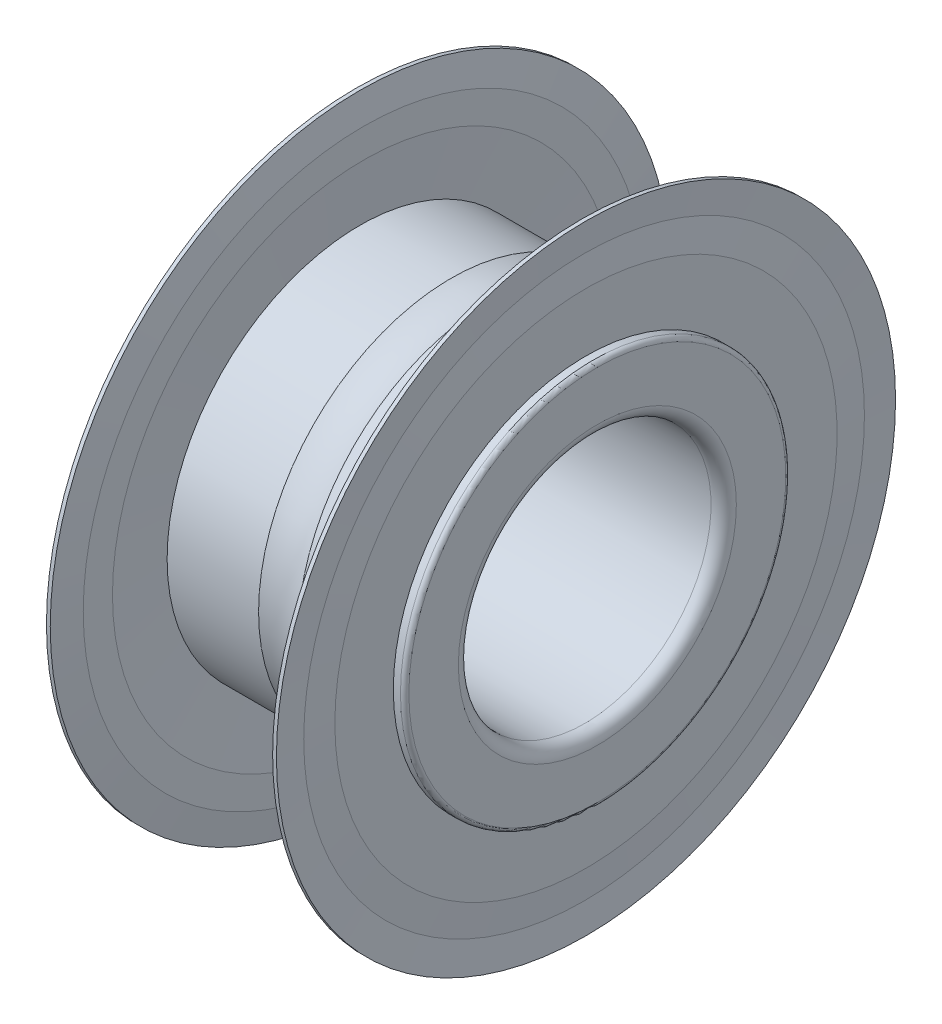
ISO-10303-21;
HEADER;
FILE_DESCRIPTION(('STEP AP214'),'2;1');
FILE_NAME('part.step','',(''),(''),'','','');
FILE_SCHEMA(('AUTOMOTIVE_DESIGN { 1 0 10303 214 1 1 1 1 }'));
ENDSEC;
DATA;
#1=APPLICATION_CONTEXT('core data for automotive mechanical design processes');
#2=APPLICATION_PROTOCOL_DEFINITION('international standard','automotive_design',2000,#1);
#3=PRODUCT_CONTEXT('',#1,'mechanical');
#4=PRODUCT('Part','Part','',(#3));
#5=PRODUCT_RELATED_PRODUCT_CATEGORY('part','',(#4));
#6=PRODUCT_DEFINITION_FORMATION('','',#4);
#7=PRODUCT_DEFINITION_CONTEXT('part definition',#1,'design');
#8=PRODUCT_DEFINITION('design','',#6,#7);
#9=PRODUCT_DEFINITION_SHAPE('','',#8);
#10=(LENGTH_UNIT() NAMED_UNIT(*) SI_UNIT(.MILLI.,.METRE.));
#11=(NAMED_UNIT(*) PLANE_ANGLE_UNIT() SI_UNIT($,.RADIAN.));
#12=(NAMED_UNIT(*) SI_UNIT($,.STERADIAN.) SOLID_ANGLE_UNIT());
#13=UNCERTAINTY_MEASURE_WITH_UNIT(LENGTH_MEASURE(1.E-05),#10,'distance_accuracy_value','');
#14=(GEOMETRIC_REPRESENTATION_CONTEXT(3) GLOBAL_UNCERTAINTY_ASSIGNED_CONTEXT((#13)) GLOBAL_UNIT_ASSIGNED_CONTEXT((#10,
#11,#12)) REPRESENTATION_CONTEXT('',''));
#15=CARTESIAN_POINT('',(0.,0.,0.));
#16=DIRECTION('',(0.,0.,1.));
#17=DIRECTION('',(1.,0.,0.));
#18=AXIS2_PLACEMENT_3D('',#15,#16,#17);
#19=CARTESIAN_POINT('',(50.,0.,0.));
#20=DIRECTION('',(-1.,0.,0.));
#21=DIRECTION('',(0.,0.,1.));
#22=AXIS2_PLACEMENT_3D('',#19,#20,#21);
#23=CYLINDRICAL_SURFACE('',#22,3.05);
#24=CARTESIAN_POINT('',(2.3122498999199,0.,0.));
#25=DIRECTION('',(-1.,0.,0.));
#26=DIRECTION('',(0.,0.,1.));
#27=AXIS2_PLACEMENT_3D('',#24,#25,#26);
#28=CIRCLE('',#27,3.05);
#29=CARTESIAN_POINT('',(2.3122498999199,0.,3.05));
#30=VERTEX_POINT('',#29);
#31=EDGE_CURVE('E72',#30,#30,#28,.T.);
#32=ORIENTED_EDGE('',*,*,#31,.F.);
#33=EDGE_LOOP('',(#32));
#34=FACE_BOUND('',#33,.T.);
#35=CARTESIAN_POINT('',(3.76,0.,0.));
#36=DIRECTION('',(-1.,0.,0.));
#37=DIRECTION('',(0.,0.,1.));
#38=AXIS2_PLACEMENT_3D('',#35,#36,#37);
#39=CIRCLE('',#38,3.05);
#40=CARTESIAN_POINT('',(3.76,0.,3.05));
#41=VERTEX_POINT('',#40);
#42=EDGE_CURVE('E10',#41,#41,#39,.F.);
#43=ORIENTED_EDGE('',*,*,#42,.F.);
#44=EDGE_LOOP('',(#43));
#45=FACE_BOUND('',#44,.T.);
#46=ADVANCED_FACE('F31',(#34,#45),#23,.T.);
#47=CARTESIAN_POINT('',(3.9333333333333,0.,0.));
#48=DIRECTION('',(-1.,0.,0.));
#49=DIRECTION('',(0.,0.,1.));
#50=AXIS2_PLACEMENT_3D('',#47,#48,#49);
#51=CIRCLE('',#50,3.05);
#52=CARTESIAN_POINT('',(3.9333333333333,0.,3.05));
#53=VERTEX_POINT('',#52);
#54=EDGE_CURVE('E69',#53,#53,#51,.T.);
#55=ORIENTED_EDGE('',*,*,#54,.T.);
#56=EDGE_LOOP('',(#55));
#57=FACE_BOUND('',#56,.T.);
#58=CARTESIAN_POINT('',(3.82,0.,0.));
#59=DIRECTION('',(-1.,0.,0.));
#60=DIRECTION('',(0.,0.,1.));
#61=AXIS2_PLACEMENT_3D('',#58,#59,#60);
#62=CIRCLE('',#61,3.05);
#63=CARTESIAN_POINT('',(3.82,0.,3.05));
#64=VERTEX_POINT('',#63);
#65=EDGE_CURVE('E38',#64,#64,#62,.T.);
#66=ORIENTED_EDGE('',*,*,#65,.F.);
#67=EDGE_LOOP('',(#66));
#68=FACE_BOUND('',#67,.T.);
#69=ADVANCED_FACE('F148',(#57,#68),#23,.T.);
#70=CARTESIAN_POINT('',(50.,0.,0.));
#71=DIRECTION('',(-1.,0.,0.));
#72=DIRECTION('',(0.,0.,1.));
#73=AXIS2_PLACEMENT_3D('',#70,#71,#72);
#74=CYLINDRICAL_SURFACE('',#73,3.05);
#75=CARTESIAN_POINT('',(0.0666666666666663,0.,0.));
#76=DIRECTION('',(-1.,0.,0.));
#77=DIRECTION('',(0.,0.,1.));
#78=AXIS2_PLACEMENT_3D('',#75,#76,#77);
#79=CIRCLE('',#78,3.05);
#80=CARTESIAN_POINT('',(0.0666666666666663,0.,3.05));
#81=VERTEX_POINT('',#80);
#82=EDGE_CURVE('E78',#81,#81,#79,.T.);
#83=ORIENTED_EDGE('',*,*,#82,.F.);
#84=EDGE_LOOP('',(#83));
#85=FACE_BOUND('',#84,.T.);
#86=CARTESIAN_POINT('',(0.18,0.,0.));
#87=DIRECTION('',(1.,0.,0.));
#88=DIRECTION('',(0.,0.,-1.));
#89=AXIS2_PLACEMENT_3D('',#86,#87,#88);
#90=CIRCLE('',#89,3.05);
#91=CARTESIAN_POINT('',(0.18,0.,-3.05));
#92=VERTEX_POINT('',#91);
#93=EDGE_CURVE('E42',#92,#92,#90,.T.);
#94=ORIENTED_EDGE('',*,*,#93,.F.);
#95=EDGE_LOOP('',(#94));
#96=FACE_BOUND('',#95,.T.);
#97=ADVANCED_FACE('F154',(#85,#96),#74,.T.);
#98=CARTESIAN_POINT('',(1.6877501000801,0.,0.));
#99=DIRECTION('',(-1.,0.,0.));
#100=DIRECTION('',(0.,0.,1.));
#101=AXIS2_PLACEMENT_3D('',#98,#99,#100);
#102=CIRCLE('',#101,3.05);
#103=CARTESIAN_POINT('',(1.6877501000801,0.,3.05));
#104=VERTEX_POINT('',#103);
#105=EDGE_CURVE('E75',#104,#104,#102,.T.);
#106=ORIENTED_EDGE('',*,*,#105,.T.);
#107=EDGE_LOOP('',(#106));
#108=FACE_BOUND('',#107,.T.);
#109=CARTESIAN_POINT('',(0.239999999999997,0.,0.));
#110=DIRECTION('',(1.,0.,0.));
#111=DIRECTION('',(0.,0.,-1.));
#112=AXIS2_PLACEMENT_3D('',#109,#110,#111);
#113=CIRCLE('',#112,3.05);
#114=CARTESIAN_POINT('',(0.239999999999997,0.,-3.05));
#115=VERTEX_POINT('',#114);
#116=EDGE_CURVE('E46',#115,#115,#113,.F.);
#117=ORIENTED_EDGE('',*,*,#116,.F.);
#118=EDGE_LOOP('',(#117));
#119=FACE_BOUND('',#118,.T.);
#120=ADVANCED_FACE('F187',(#108,#119),#74,.T.);
#121=CARTESIAN_POINT('',(0.0666666666667299,0.,0.));
#122=DIRECTION('',(-1.,0.,0.));
#123=DIRECTION('',(0.,0.,1.));
#124=AXIS2_PLACEMENT_3D('',#121,#122,#123);
#125=TOROIDAL_SURFACE('',#124,2.98333333333327,0.06666666666673);
#126=CARTESIAN_POINT('',(0.,0.,0.));
#127=DIRECTION('',(-1.,0.,0.));
#128=DIRECTION('',(0.,0.,1.));
#129=AXIS2_PLACEMENT_3D('',#126,#127,#128);
#130=CIRCLE('',#129,2.9833333333333);
#131=CARTESIAN_POINT('',(0.,0.,2.9833333333333));
#132=VERTEX_POINT('',#131);
#133=EDGE_CURVE('E51',#132,#132,#130,.T.);
#134=ORIENTED_EDGE('',*,*,#133,.F.);
#135=EDGE_LOOP('',(#134));
#136=FACE_BOUND('',#135,.T.);
#137=ORIENTED_EDGE('',*,*,#82,.T.);
#138=EDGE_LOOP('',(#137));
#139=FACE_BOUND('',#138,.T.);
#140=ADVANCED_FACE('F33',(#136,#139),#125,.T.);
#141=CARTESIAN_POINT('',(0.,2.9833333333333,0.));
#142=DIRECTION('',(1.,0.,0.));
#143=DIRECTION('',(0.,0.,-1.));
#144=AXIS2_PLACEMENT_3D('',#141,#142,#143);
#145=PLANE('',#144);
#146=CARTESIAN_POINT('',(0.,0.,0.));
#147=DIRECTION('',(-1.,0.,0.));
#148=DIRECTION('',(0.,0.,1.));
#149=AXIS2_PLACEMENT_3D('',#146,#147,#148);
#150=CIRCLE('',#149,2.2);
#151=CARTESIAN_POINT('',(0.,0.,2.2));
#152=VERTEX_POINT('',#151);
#153=EDGE_CURVE('E54',#152,#152,#150,.T.);
#154=ORIENTED_EDGE('',*,*,#153,.F.);
#155=EDGE_LOOP('',(#154));
#156=FACE_BOUND('',#155,.T.);
#157=ORIENTED_EDGE('',*,*,#133,.T.);
#158=EDGE_LOOP('',(#157));
#159=FACE_BOUND('',#158,.T.);
#160=ADVANCED_FACE('F180',(#156,#159),#145,.F.);
#161=CARTESIAN_POINT('',(0.200000000000017,0.,0.));
#162=DIRECTION('',(-1.,0.,0.));
#163=DIRECTION('',(0.,0.,1.));
#164=AXIS2_PLACEMENT_3D('',#161,#162,#163);
#165=TOROIDAL_SURFACE('',#164,2.20000000000002,0.200000000000017);
#166=CARTESIAN_POINT('',(0.199999999999999,0.,0.));
#167=DIRECTION('',(-1.,0.,0.));
#168=DIRECTION('',(0.,0.,1.));
#169=AXIS2_PLACEMENT_3D('',#166,#167,#168);
#170=CIRCLE('',#169,2.);
#171=CARTESIAN_POINT('',(0.199999999999999,0.,2.));
#172=VERTEX_POINT('',#171);
#173=EDGE_CURVE('E57',#172,#172,#170,.T.);
#174=ORIENTED_EDGE('',*,*,#173,.F.);
#175=EDGE_LOOP('',(#174));
#176=FACE_BOUND('',#175,.T.);
#177=ORIENTED_EDGE('',*,*,#153,.T.);
#178=EDGE_LOOP('',(#177));
#179=FACE_BOUND('',#178,.T.);
#180=ADVANCED_FACE('F177',(#176,#179),#165,.T.);
#181=CARTESIAN_POINT('',(50.,0.,0.));
#182=DIRECTION('',(-1.,0.,0.));
#183=DIRECTION('',(0.,0.,1.));
#184=AXIS2_PLACEMENT_3D('',#181,#182,#183);
#185=CYLINDRICAL_SURFACE('',#184,2.);
#186=CARTESIAN_POINT('',(3.8,0.,0.));
#187=DIRECTION('',(-1.,0.,0.));
#188=DIRECTION('',(0.,0.,1.));
#189=AXIS2_PLACEMENT_3D('',#186,#187,#188);
#190=CIRCLE('',#189,2.);
#191=CARTESIAN_POINT('',(3.8,0.,2.));
#192=VERTEX_POINT('',#191);
#193=EDGE_CURVE('E60',#192,#192,#190,.T.);
#194=ORIENTED_EDGE('',*,*,#193,.F.);
#195=EDGE_LOOP('',(#194));
#196=FACE_BOUND('',#195,.T.);
#197=ORIENTED_EDGE('',*,*,#173,.T.);
#198=EDGE_LOOP('',(#197));
#199=FACE_BOUND('',#198,.T.);
#200=ADVANCED_FACE('F173',(#196,#199),#185,.F.);
#201=CARTESIAN_POINT('',(3.79999999999997,0.,0.));
#202=DIRECTION('',(-1.,0.,0.));
#203=DIRECTION('',(0.,0.,1.));
#204=AXIS2_PLACEMENT_3D('',#201,#202,#203);
#205=TOROIDAL_SURFACE('',#204,2.20000000000003,0.200000000000033);
#206=CARTESIAN_POINT('',(4.,0.,0.));
#207=DIRECTION('',(-1.,0.,0.));
#208=DIRECTION('',(0.,0.,1.));
#209=AXIS2_PLACEMENT_3D('',#206,#207,#208);
#210=CIRCLE('',#209,2.20000000000003);
#211=CARTESIAN_POINT('',(4.,0.,2.20000000000003));
#212=VERTEX_POINT('',#211);
#213=EDGE_CURVE('E63',#212,#212,#210,.T.);
#214=ORIENTED_EDGE('',*,*,#213,.F.);
#215=EDGE_LOOP('',(#214));
#216=FACE_BOUND('',#215,.T.);
#217=ORIENTED_EDGE('',*,*,#193,.T.);
#218=EDGE_LOOP('',(#217));
#219=FACE_BOUND('',#218,.T.);
#220=ADVANCED_FACE('F169',(#216,#219),#205,.T.);
#221=CARTESIAN_POINT('',(4.,2.2,0.));
#222=DIRECTION('',(-1.,0.,0.));
#223=DIRECTION('',(0.,0.,1.));
#224=AXIS2_PLACEMENT_3D('',#221,#222,#223);
#225=PLANE('',#224);
#226=CARTESIAN_POINT('',(4.,0.,0.));
#227=DIRECTION('',(-1.,0.,0.));
#228=DIRECTION('',(0.,0.,1.));
#229=AXIS2_PLACEMENT_3D('',#226,#227,#228);
#230=CIRCLE('',#229,2.9833333333333);
#231=CARTESIAN_POINT('',(4.,0.,2.9833333333333));
#232=VERTEX_POINT('',#231);
#233=EDGE_CURVE('E66',#232,#232,#230,.T.);
#234=ORIENTED_EDGE('',*,*,#233,.F.);
#235=EDGE_LOOP('',(#234));
#236=FACE_BOUND('',#235,.T.);
#237=ORIENTED_EDGE('',*,*,#213,.T.);
#238=EDGE_LOOP('',(#237));
#239=FACE_BOUND('',#238,.T.);
#240=ADVANCED_FACE('F165',(#236,#239),#225,.F.);
#241=CARTESIAN_POINT('',(3.93333333333321,0.,0.));
#242=DIRECTION('',(-1.,0.,0.));
#243=DIRECTION('',(0.,0.,1.));
#244=AXIS2_PLACEMENT_3D('',#241,#242,#243);
#245=TOROIDAL_SURFACE('',#244,2.98333333333321,0.0666666666667918);
#246=ORIENTED_EDGE('',*,*,#54,.F.);
#247=EDGE_LOOP('',(#246));
#248=FACE_BOUND('',#247,.T.);
#249=ORIENTED_EDGE('',*,*,#233,.T.);
#250=EDGE_LOOP('',(#249));
#251=FACE_BOUND('',#250,.T.);
#252=ADVANCED_FACE('F162',(#248,#251),#245,.T.);
#253=CARTESIAN_POINT('',(2.,0.,0.));
#254=DIRECTION('',(-1.,0.,0.));
#255=DIRECTION('',(0.,0.,1.));
#256=AXIS2_PLACEMENT_3D('',#253,#254,#255);
#257=TOROIDAL_SURFACE('',#256,3.99999999999988,0.999999999999878);
#258=ORIENTED_EDGE('',*,*,#105,.F.);
#259=EDGE_LOOP('',(#258));
#260=FACE_BOUND('',#259,.T.);
#261=ORIENTED_EDGE('',*,*,#31,.T.);
#262=EDGE_LOOP('',(#261));
#263=FACE_BOUND('',#262,.T.);
#264=ADVANCED_FACE('F160',(#260,#263),#257,.F.);
#265=CARTESIAN_POINT('',(50.,0.,0.));
#266=DIRECTION('',(-1.,0.,0.));
#267=DIRECTION('',(0.,0.,1.));
#268=AXIS2_PLACEMENT_3D('',#265,#266,#267);
#269=CYLINDRICAL_SURFACE('',#268,4.9);
#270=CARTESIAN_POINT('',(0.18,0.,0.));
#271=DIRECTION('',(-1.,0.,0.));
#272=DIRECTION('',(0.,0.,1.));
#273=AXIS2_PLACEMENT_3D('',#270,#271,#272);
#274=CIRCLE('',#273,4.9);
#275=CARTESIAN_POINT('',(0.18,0.,4.9));
#276=VERTEX_POINT('',#275);
#277=EDGE_CURVE('E81',#276,#276,#274,.T.);
#278=ORIENTED_EDGE('',*,*,#277,.F.);
#279=EDGE_LOOP('',(#278));
#280=FACE_BOUND('',#279,.T.);
#281=CARTESIAN_POINT('',(0.239999999999997,0.,0.));
#282=DIRECTION('',(-1.,0.,0.));
#283=DIRECTION('',(0.,0.,1.));
#284=AXIS2_PLACEMENT_3D('',#281,#282,#283);
#285=CIRCLE('',#284,4.9);
#286=CARTESIAN_POINT('',(0.239999999999997,0.,4.9));
#287=VERTEX_POINT('',#286);
#288=EDGE_CURVE('E96',#287,#287,#285,.T.);
#289=ORIENTED_EDGE('',*,*,#288,.T.);
#290=EDGE_LOOP('',(#289));
#291=FACE_BOUND('',#290,.T.);
#292=ADVANCED_FACE('F215',(#280,#291),#269,.T.);
#293=CARTESIAN_POINT('',(0.18,0.,0.));
#294=DIRECTION('',(-1.,0.,0.));
#295=DIRECTION('',(0.,0.,1.));
#296=AXIS2_PLACEMENT_3D('',#293,#294,#295);
#297=CONICAL_SURFACE('',#296,4.9,1.50602220486897);
#298=CARTESIAN_POINT('',(0.210000000000002,0.,0.));
#299=DIRECTION('',(-1.,0.,0.));
#300=DIRECTION('',(0.,0.,1.));
#301=AXIS2_PLACEMENT_3D('',#298,#299,#300);
#302=CIRCLE('',#301,4.4375);
#303=CARTESIAN_POINT('',(0.210000000000002,0.,4.4375));
#304=VERTEX_POINT('',#303);
#305=EDGE_CURVE('E84',#304,#304,#302,.T.);
#306=ORIENTED_EDGE('',*,*,#305,.F.);
#307=EDGE_LOOP('',(#306));
#308=FACE_BOUND('',#307,.T.);
#309=ORIENTED_EDGE('',*,*,#277,.T.);
#310=EDGE_LOOP('',(#309));
#311=FACE_BOUND('',#310,.T.);
#312=ADVANCED_FACE('F209',(#308,#311),#297,.F.);
#313=CARTESIAN_POINT('',(0.210000000000002,0.,0.));
#314=DIRECTION('',(1.,0.,0.));
#315=DIRECTION('',(0.,0.,-1.));
#316=AXIS2_PLACEMENT_3D('',#313,#314,#315);
#317=CONICAL_SURFACE('',#316,4.4375,1.50602220486897);
#318=CARTESIAN_POINT('',(0.18,0.,0.));
#319=DIRECTION('',(-1.,0.,0.));
#320=DIRECTION('',(0.,0.,1.));
#321=AXIS2_PLACEMENT_3D('',#318,#319,#320);
#322=CIRCLE('',#321,3.975);
#323=CARTESIAN_POINT('',(0.18,0.,3.975));
#324=VERTEX_POINT('',#323);
#325=EDGE_CURVE('E87',#324,#324,#322,.T.);
#326=ORIENTED_EDGE('',*,*,#325,.F.);
#327=EDGE_LOOP('',(#326));
#328=FACE_BOUND('',#327,.T.);
#329=ORIENTED_EDGE('',*,*,#305,.T.);
#330=EDGE_LOOP('',(#329));
#331=FACE_BOUND('',#330,.T.);
#332=ADVANCED_FACE('F203',(#328,#331),#317,.T.);
#333=CARTESIAN_POINT('',(0.18,3.975,0.));
#334=DIRECTION('',(1.,0.,0.));
#335=DIRECTION('',(0.,0.,-1.));
#336=AXIS2_PLACEMENT_3D('',#333,#334,#335);
#337=PLANE('',#336);
#338=ORIENTED_EDGE('',*,*,#93,.T.);
#339=EDGE_LOOP('',(#338));
#340=FACE_BOUND('',#339,.T.);
#341=ORIENTED_EDGE('',*,*,#325,.T.);
#342=EDGE_LOOP('',(#341));
#343=FACE_BOUND('',#342,.T.);
#344=ADVANCED_FACE('F199',(#340,#343),#337,.F.);
#345=CARTESIAN_POINT('',(0.239999999999997,0.,0.));
#346=DIRECTION('',(1.,0.,0.));
#347=DIRECTION('',(0.,0.,-1.));
#348=AXIS2_PLACEMENT_3D('',#345,#346,#347);
#349=CONICAL_SURFACE('',#348,3.05,1.50602220486897);
#350=CARTESIAN_POINT('',(0.300000000000002,0.,0.));
#351=DIRECTION('',(-1.,0.,0.));
#352=DIRECTION('',(0.,0.,1.));
#353=AXIS2_PLACEMENT_3D('',#350,#351,#352);
#354=CIRCLE('',#353,3.975);
#355=CARTESIAN_POINT('',(0.300000000000002,0.,3.975));
#356=VERTEX_POINT('',#355);
#357=EDGE_CURVE('E90',#356,#356,#354,.T.);
#358=ORIENTED_EDGE('',*,*,#357,.F.);
#359=EDGE_LOOP('',(#358));
#360=FACE_BOUND('',#359,.T.);
#361=ORIENTED_EDGE('',*,*,#116,.T.);
#362=EDGE_LOOP('',(#361));
#363=FACE_BOUND('',#362,.T.);
#364=ADVANCED_FACE('F202',(#360,#363),#349,.F.);
#365=CARTESIAN_POINT('',(0.3,3.975,0.));
#366=DIRECTION('',(-1.,0.,0.));
#367=DIRECTION('',(0.,0.,1.));
#368=AXIS2_PLACEMENT_3D('',#365,#366,#367);
#369=PLANE('',#368);
#370=CARTESIAN_POINT('',(0.300000000000002,0.,0.));
#371=DIRECTION('',(-1.,0.,0.));
#372=DIRECTION('',(0.,0.,1.));
#373=AXIS2_PLACEMENT_3D('',#370,#371,#372);
#374=CIRCLE('',#373,4.4375);
#375=CARTESIAN_POINT('',(0.300000000000002,0.,4.4375));
#376=VERTEX_POINT('',#375);
#377=EDGE_CURVE('E93',#376,#376,#374,.T.);
#378=ORIENTED_EDGE('',*,*,#377,.F.);
#379=EDGE_LOOP('',(#378));
#380=FACE_BOUND('',#379,.T.);
#381=ORIENTED_EDGE('',*,*,#357,.T.);
#382=EDGE_LOOP('',(#381));
#383=FACE_BOUND('',#382,.T.);
#384=ADVANCED_FACE('F227',(#380,#383),#369,.F.);
#385=CARTESIAN_POINT('',(0.300000000000002,0.,0.));
#386=DIRECTION('',(-1.,0.,0.));
#387=DIRECTION('',(0.,0.,1.));
#388=AXIS2_PLACEMENT_3D('',#385,#386,#387);
#389=CONICAL_SURFACE('',#388,4.4375,1.44178711053551);
#390=ORIENTED_EDGE('',*,*,#288,.F.);
#391=EDGE_LOOP('',(#390));
#392=FACE_BOUND('',#391,.T.);
#393=ORIENTED_EDGE('',*,*,#377,.T.);
#394=EDGE_LOOP('',(#393));
#395=FACE_BOUND('',#394,.T.);
#396=ADVANCED_FACE('F224',(#392,#395),#389,.T.);
#397=CARTESIAN_POINT('',(3.76,0.,0.));
#398=DIRECTION('',(1.,0.,0.));
#399=DIRECTION('',(0.,0.,-1.));
#400=AXIS2_PLACEMENT_3D('',#397,#398,#399);
#401=CONICAL_SURFACE('',#400,4.9,1.44178711053552);
#402=CARTESIAN_POINT('',(3.7,0.,0.));
#403=DIRECTION('',(-1.,0.,0.));
#404=DIRECTION('',(0.,0.,1.));
#405=AXIS2_PLACEMENT_3D('',#402,#403,#404);
#406=CIRCLE('',#405,4.4375);
#407=CARTESIAN_POINT('',(3.7,0.,4.4375));
#408=VERTEX_POINT('',#407);
#409=EDGE_CURVE('E99',#408,#408,#406,.T.);
#410=ORIENTED_EDGE('',*,*,#409,.F.);
#411=EDGE_LOOP('',(#410));
#412=FACE_BOUND('',#411,.T.);
#413=CARTESIAN_POINT('',(3.76,0.,0.));
#414=DIRECTION('',(-1.,0.,0.));
#415=DIRECTION('',(0.,0.,1.));
#416=AXIS2_PLACEMENT_3D('',#413,#414,#415);
#417=CIRCLE('',#416,4.9);
#418=CARTESIAN_POINT('',(3.76,0.,4.9));
#419=VERTEX_POINT('',#418);
#420=EDGE_CURVE('E114',#419,#419,#417,.T.);
#421=ORIENTED_EDGE('',*,*,#420,.T.);
#422=EDGE_LOOP('',(#421));
#423=FACE_BOUND('',#422,.T.);
#424=ADVANCED_FACE('F118',(#412,#423),#401,.T.);
#425=CARTESIAN_POINT('',(3.7,4.4375,0.));
#426=DIRECTION('',(1.,0.,0.));
#427=DIRECTION('',(0.,0.,-1.));
#428=AXIS2_PLACEMENT_3D('',#425,#426,#427);
#429=PLANE('',#428);
#430=CARTESIAN_POINT('',(3.7,0.,0.));
#431=DIRECTION('',(-1.,0.,0.));
#432=DIRECTION('',(0.,0.,1.));
#433=AXIS2_PLACEMENT_3D('',#430,#431,#432);
#434=CIRCLE('',#433,3.975);
#435=CARTESIAN_POINT('',(3.7,0.,3.975));
#436=VERTEX_POINT('',#435);
#437=EDGE_CURVE('E102',#436,#436,#434,.T.);
#438=ORIENTED_EDGE('',*,*,#437,.F.);
#439=EDGE_LOOP('',(#438));
#440=FACE_BOUND('',#439,.T.);
#441=ORIENTED_EDGE('',*,*,#409,.T.);
#442=EDGE_LOOP('',(#441));
#443=FACE_BOUND('',#442,.T.);
#444=ADVANCED_FACE('F145',(#440,#443),#429,.F.);
#445=CARTESIAN_POINT('',(3.7,0.,0.));
#446=DIRECTION('',(-1.,0.,0.));
#447=DIRECTION('',(0.,0.,1.));
#448=AXIS2_PLACEMENT_3D('',#445,#446,#447);
#449=CONICAL_SURFACE('',#448,3.975,1.50602220486898);
#450=ORIENTED_EDGE('',*,*,#42,.T.);
#451=EDGE_LOOP('',(#450));
#452=FACE_BOUND('',#451,.T.);
#453=ORIENTED_EDGE('',*,*,#437,.T.);
#454=EDGE_LOOP('',(#453));
#455=FACE_BOUND('',#454,.T.);
#456=ADVANCED_FACE('F140',(#452,#455),#449,.F.);
#457=CARTESIAN_POINT('',(3.82,3.05,0.));
#458=DIRECTION('',(-1.,0.,0.));
#459=DIRECTION('',(0.,0.,1.));
#460=AXIS2_PLACEMENT_3D('',#457,#458,#459);
#461=PLANE('',#460);
#462=CARTESIAN_POINT('',(3.82,0.,0.));
#463=DIRECTION('',(-1.,0.,0.));
#464=DIRECTION('',(0.,0.,1.));
#465=AXIS2_PLACEMENT_3D('',#462,#463,#464);
#466=CIRCLE('',#465,3.975);
#467=CARTESIAN_POINT('',(3.82,0.,3.975));
#468=VERTEX_POINT('',#467);
#469=EDGE_CURVE('E105',#468,#468,#466,.T.);
#470=ORIENTED_EDGE('',*,*,#469,.F.);
#471=EDGE_LOOP('',(#470));
#472=FACE_BOUND('',#471,.T.);
#473=ORIENTED_EDGE('',*,*,#65,.T.);
#474=EDGE_LOOP('',(#473));
#475=FACE_BOUND('',#474,.T.);
#476=ADVANCED_FACE('F135',(#472,#475),#461,.F.);
#477=CARTESIAN_POINT('',(3.82,0.,0.));
#478=DIRECTION('',(-1.,0.,0.));
#479=DIRECTION('',(0.,0.,1.));
#480=AXIS2_PLACEMENT_3D('',#477,#478,#479);
#481=CONICAL_SURFACE('',#480,3.975,1.50602220486899);
#482=CARTESIAN_POINT('',(3.79,0.,0.));
#483=DIRECTION('',(-1.,0.,0.));
#484=DIRECTION('',(0.,0.,1.));
#485=AXIS2_PLACEMENT_3D('',#482,#483,#484);
#486=CIRCLE('',#485,4.4375);
#487=CARTESIAN_POINT('',(3.79,0.,4.4375));
#488=VERTEX_POINT('',#487);
#489=EDGE_CURVE('E108',#488,#488,#486,.T.);
#490=ORIENTED_EDGE('',*,*,#489,.F.);
#491=EDGE_LOOP('',(#490));
#492=FACE_BOUND('',#491,.T.);
#493=ORIENTED_EDGE('',*,*,#469,.T.);
#494=EDGE_LOOP('',(#493));
#495=FACE_BOUND('',#494,.T.);
#496=ADVANCED_FACE('F129',(#492,#495),#481,.T.);
#497=CARTESIAN_POINT('',(3.79,0.,0.));
#498=DIRECTION('',(1.,0.,0.));
#499=DIRECTION('',(0.,0.,-1.));
#500=AXIS2_PLACEMENT_3D('',#497,#498,#499);
#501=CONICAL_SURFACE('',#500,4.4375,1.50602220486899);
#502=CARTESIAN_POINT('',(3.82,0.,0.));
#503=DIRECTION('',(-1.,0.,0.));
#504=DIRECTION('',(0.,0.,1.));
#505=AXIS2_PLACEMENT_3D('',#502,#503,#504);
#506=CIRCLE('',#505,4.9);
#507=CARTESIAN_POINT('',(3.82,0.,4.9));
#508=VERTEX_POINT('',#507);
#509=EDGE_CURVE('E111',#508,#508,#506,.T.);
#510=ORIENTED_EDGE('',*,*,#509,.F.);
#511=EDGE_LOOP('',(#510));
#512=FACE_BOUND('',#511,.T.);
#513=ORIENTED_EDGE('',*,*,#489,.T.);
#514=EDGE_LOOP('',(#513));
#515=FACE_BOUND('',#514,.T.);
#516=ADVANCED_FACE('F123',(#512,#515),#501,.F.);
#517=CARTESIAN_POINT('',(50.,0.,0.));
#518=DIRECTION('',(-1.,0.,0.));
#519=DIRECTION('',(0.,0.,1.));
#520=AXIS2_PLACEMENT_3D('',#517,#518,#519);
#521=CYLINDRICAL_SURFACE('',#520,4.9);
#522=ORIENTED_EDGE('',*,*,#420,.F.);
#523=EDGE_LOOP('',(#522));
#524=FACE_BOUND('',#523,.T.);
#525=ORIENTED_EDGE('',*,*,#509,.T.);
#526=EDGE_LOOP('',(#525));
#527=FACE_BOUND('',#526,.T.);
#528=ADVANCED_FACE('F120',(#524,#527),#521,.T.);
#529=CLOSED_SHELL('',(#46,#69,#97,#120,#140,#160,#180,#200,#220,#240,#252,#264,#292,#312,#332,
#344,#364,#384,#396,#424,#444,#456,#476,#496,#516,#528));
#530=MANIFOLD_SOLID_BREP('B2',#529);
#531=ADVANCED_BREP_SHAPE_REPRESENTATION('',(#18,#530),#14);
#532=SHAPE_DEFINITION_REPRESENTATION(#9,#531);
ENDSEC;
END-ISO-10303-21;
